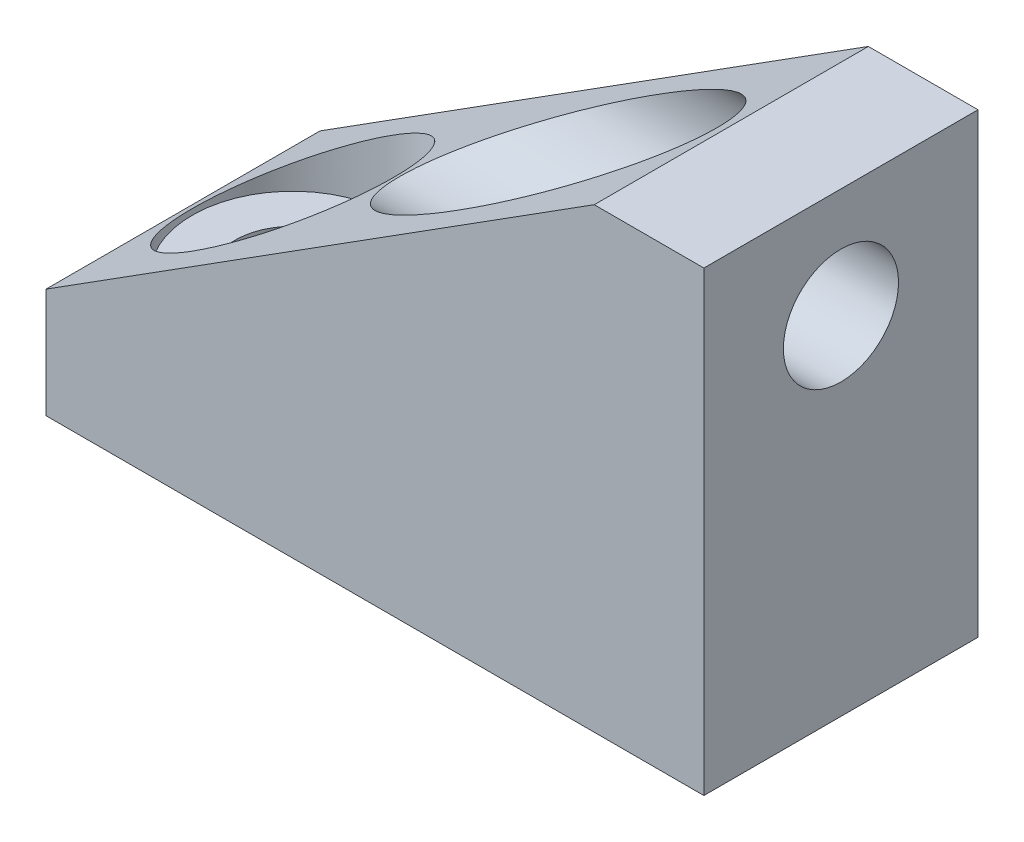
ISO-10303-21;
HEADER;
FILE_DESCRIPTION(('STEP AP214'),'2;1');
FILE_NAME('part.step','',(''),(''),'','','');
FILE_SCHEMA(('AUTOMOTIVE_DESIGN { 1 0 10303 214 1 1 1 1 }'));
ENDSEC;
DATA;
#1=APPLICATION_CONTEXT('core data for automotive mechanical design processes');
#2=APPLICATION_PROTOCOL_DEFINITION('international standard','automotive_design',2000,#1);
#3=PRODUCT_CONTEXT('',#1,'mechanical');
#4=PRODUCT('Part','Part','',(#3));
#5=PRODUCT_RELATED_PRODUCT_CATEGORY('part','',(#4));
#6=PRODUCT_DEFINITION_FORMATION('','',#4);
#7=PRODUCT_DEFINITION_CONTEXT('part definition',#1,'design');
#8=PRODUCT_DEFINITION('design','',#6,#7);
#9=PRODUCT_DEFINITION_SHAPE('','',#8);
#10=(LENGTH_UNIT() NAMED_UNIT(*) SI_UNIT(.MILLI.,.METRE.));
#11=(NAMED_UNIT(*) PLANE_ANGLE_UNIT() SI_UNIT($,.RADIAN.));
#12=(NAMED_UNIT(*) SI_UNIT($,.STERADIAN.) SOLID_ANGLE_UNIT());
#13=UNCERTAINTY_MEASURE_WITH_UNIT(LENGTH_MEASURE(1.E-05),#10,'distance_accuracy_value','');
#14=(GEOMETRIC_REPRESENTATION_CONTEXT(3) GLOBAL_UNCERTAINTY_ASSIGNED_CONTEXT((#13)) GLOBAL_UNIT_ASSIGNED_CONTEXT((#10,
#11,#12)) REPRESENTATION_CONTEXT('',''));
#15=CARTESIAN_POINT('',(0.,0.,0.));
#16=DIRECTION('',(0.,0.,1.));
#17=DIRECTION('',(1.,0.,0.));
#18=AXIS2_PLACEMENT_3D('',#15,#16,#17);
#19=CARTESIAN_POINT('',(-2.04027772216514,3.22149114026075,15.));
#20=DIRECTION('',(-0.535052081184345,0.844819075554228,0.));
#21=DIRECTION('',(-0.844819075554229,-0.535052081184345,0.));
#22=AXIS2_PLACEMENT_3D('',#19,#20,#21);
#23=PLANE('',#22);
#24=DIRECTION('',(0.844819075554229,0.535052081184345,0.));
#25=VECTOR('',#24,1.);
#26=CARTESIAN_POINT('',(-2.04027772216514,3.22149114026075,0.));
#27=LINE('',#26,#25);
#28=CARTESIAN_POINT('',(2.34684153005472,6.,0.));
#29=VERTEX_POINT('',#28);
#30=CARTESIAN_POINT('',(32.3468415300547,25.,0.));
#31=VERTEX_POINT('',#30);
#32=EDGE_CURVE('E126',#29,#31,#27,.T.);
#33=ORIENTED_EDGE('',*,*,#32,.F.);
#34=DIRECTION('',(0.,0.,-1.));
#35=VECTOR('',#34,1.);
#36=CARTESIAN_POINT('',(2.34684153005472,6.,15.));
#37=LINE('',#36,#35);
#38=CARTESIAN_POINT('',(2.34684153005472,6.,15.));
#39=VERTEX_POINT('',#38);
#40=EDGE_CURVE('E12',#39,#29,#37,.T.);
#41=ORIENTED_EDGE('',*,*,#40,.F.);
#42=DIRECTION('',(0.844819075554229,0.535052081184345,0.));
#43=VECTOR('',#42,1.);
#44=CARTESIAN_POINT('',(-2.04027772216514,3.22149114026075,15.));
#45=LINE('',#44,#43);
#46=CARTESIAN_POINT('',(32.3468415300547,25.,15.));
#47=VERTEX_POINT('',#46);
#48=EDGE_CURVE('E142',#39,#47,#45,.T.);
#49=ORIENTED_EDGE('',*,*,#48,.T.);
#50=DIRECTION('',(0.,0.,-1.));
#51=VECTOR('',#50,1.);
#52=CARTESIAN_POINT('',(32.3468415300547,25.,15.));
#53=LINE('',#52,#51);
#54=EDGE_CURVE('E92',#47,#31,#53,.T.);
#55=ORIENTED_EDGE('',*,*,#54,.T.);
#56=EDGE_LOOP('',(#33,#41,#49,#55));
#57=FACE_BOUND('',#56,.T.);
#58=CARTESIAN_POINT('',(8.34684153005472,9.8,7.5));
#59=DIRECTION('',(-0.535052081184345,0.844819075554228,0.));
#60=DIRECTION('',(0.844819075554229,0.535052081184345,0.));
#61=AXIS2_PLACEMENT_3D('',#58,#59,#60);
#62=ELLIPSE('',#61,6.51026966500706,5.5);
#63=CARTESIAN_POINT('',(13.8468415300547,13.2833333333333,7.5));
#64=VERTEX_POINT('',#63);
#65=EDGE_CURVE('E148',#64,#64,#62,.T.);
#66=ORIENTED_EDGE('',*,*,#65,.F.);
#67=EDGE_LOOP('',(#66));
#68=FACE_BOUND('',#67,.T.);
#69=CARTESIAN_POINT('',(22.8731573195284,19.,7.49999999999999));
#70=DIRECTION('',(-0.535052081184345,0.844819075554228,0.));
#71=DIRECTION('',(-0.844819075554229,-0.535052081184345,0.));
#72=AXIS2_PLACEMENT_3D('',#69,#70,#71);
#73=ELLIPSE('',#72,10.2793731552743,5.5);
#74=CARTESIAN_POINT('',(14.1889467932126,13.5,7.49999999999999));
#75=VERTEX_POINT('',#74);
#76=EDGE_CURVE('E50',#75,#75,#73,.F.);
#77=ORIENTED_EDGE('',*,*,#76,.T.);
#78=EDGE_LOOP('',(#77));
#79=FACE_BOUND('',#78,.T.);
#80=ADVANCED_FACE('F47',(#57,#68,#79),#23,.T.);
#81=CARTESIAN_POINT('',(38.3468415300547,19.,7.49999999999999));
#82=DIRECTION('',(-1.,0.,0.));
#83=DIRECTION('',(0.,0.,1.));
#84=AXIS2_PLACEMENT_3D('',#81,#82,#83);
#85=CYLINDRICAL_SURFACE('',#84,3.15);
#86=CARTESIAN_POINT('',(38.3468415300547,19.,7.49999999999999));
#87=DIRECTION('',(1.,0.,0.));
#88=DIRECTION('',(0.,0.,-1.));
#89=AXIS2_PLACEMENT_3D('',#86,#87,#88);
#90=CIRCLE('',#89,3.15);
#91=CARTESIAN_POINT('',(38.3468415300547,19.,4.34999999999999));
#92=VERTEX_POINT('',#91);
#93=EDGE_CURVE('E165',#92,#92,#90,.T.);
#94=ORIENTED_EDGE('',*,*,#93,.T.);
#95=EDGE_LOOP('',(#94));
#96=FACE_BOUND('',#95,.T.);
#97=CARTESIAN_POINT('',(32.3468415300547,19.,7.49999999999999));
#98=DIRECTION('',(-1.,0.,0.));
#99=DIRECTION('',(0.,0.,1.));
#100=AXIS2_PLACEMENT_3D('',#97,#98,#99);
#101=CIRCLE('',#100,3.15);
#102=CARTESIAN_POINT('',(32.3468415300547,19.,10.65));
#103=VERTEX_POINT('',#102);
#104=EDGE_CURVE('E187',#103,#103,#101,.T.);
#105=ORIENTED_EDGE('',*,*,#104,.T.);
#106=EDGE_LOOP('',(#105));
#107=FACE_BOUND('',#106,.T.);
#108=ADVANCED_FACE('F181',(#96,#107),#85,.F.);
#109=CARTESIAN_POINT('',(8.34684153005472,0.,7.5));
#110=DIRECTION('',(0.,1.,0.));
#111=DIRECTION('',(0.,0.,1.));
#112=AXIS2_PLACEMENT_3D('',#109,#110,#111);
#113=CYLINDRICAL_SURFACE('',#112,3.15);
#114=CARTESIAN_POINT('',(8.34684153005472,0.,7.5));
#115=DIRECTION('',(0.,1.,0.));
#116=DIRECTION('',(0.,0.,1.));
#117=AXIS2_PLACEMENT_3D('',#114,#115,#116);
#118=CIRCLE('',#117,3.15);
#119=CARTESIAN_POINT('',(8.34684153005472,0.,10.65));
#120=VERTEX_POINT('',#119);
#121=EDGE_CURVE('E131',#120,#120,#118,.T.);
#122=ORIENTED_EDGE('',*,*,#121,.F.);
#123=EDGE_LOOP('',(#122));
#124=FACE_BOUND('',#123,.T.);
#125=CARTESIAN_POINT('',(8.34684153005472,6.,7.5));
#126=DIRECTION('',(0.,1.,0.));
#127=DIRECTION('',(0.,0.,1.));
#128=AXIS2_PLACEMENT_3D('',#125,#126,#127);
#129=CIRCLE('',#128,3.15);
#130=CARTESIAN_POINT('',(8.34684153005472,6.,10.65));
#131=VERTEX_POINT('',#130);
#132=EDGE_CURVE('E159',#131,#131,#129,.T.);
#133=ORIENTED_EDGE('',*,*,#132,.T.);
#134=EDGE_LOOP('',(#133));
#135=FACE_BOUND('',#134,.T.);
#136=ADVANCED_FACE('F218',(#124,#135),#113,.F.);
#137=CARTESIAN_POINT('',(2.34684153005472,0.,15.));
#138=DIRECTION('',(-1.,0.,0.));
#139=DIRECTION('',(0.,0.,1.));
#140=AXIS2_PLACEMENT_3D('',#137,#138,#139);
#141=PLANE('',#140);
#142=DIRECTION('',(0.,1.,0.));
#143=VECTOR('',#142,1.);
#144=CARTESIAN_POINT('',(2.34684153005472,0.,0.));
#145=LINE('',#144,#143);
#146=CARTESIAN_POINT('',(2.34684153005472,0.,0.));
#147=VERTEX_POINT('',#146);
#148=EDGE_CURVE('E130',#147,#29,#145,.T.);
#149=ORIENTED_EDGE('',*,*,#148,.F.);
#150=DIRECTION('',(0.,0.,-1.));
#151=VECTOR('',#150,1.);
#152=CARTESIAN_POINT('',(2.34684153005472,0.,15.));
#153=LINE('',#152,#151);
#154=CARTESIAN_POINT('',(2.34684153005472,0.,15.));
#155=VERTEX_POINT('',#154);
#156=EDGE_CURVE('E57',#155,#147,#153,.T.);
#157=ORIENTED_EDGE('',*,*,#156,.F.);
#158=DIRECTION('',(0.,1.,0.));
#159=VECTOR('',#158,1.);
#160=CARTESIAN_POINT('',(2.34684153005472,0.,15.));
#161=LINE('',#160,#159);
#162=EDGE_CURVE('E108',#155,#39,#161,.T.);
#163=ORIENTED_EDGE('',*,*,#162,.T.);
#164=ORIENTED_EDGE('',*,*,#40,.T.);
#165=EDGE_LOOP('',(#149,#157,#163,#164));
#166=FACE_BOUND('',#165,.T.);
#167=ADVANCED_FACE('F173',(#166),#141,.T.);
#168=CARTESIAN_POINT('',(0.,0.,15.));
#169=DIRECTION('',(0.,1.,0.));
#170=DIRECTION('',(0.,0.,1.));
#171=AXIS2_PLACEMENT_3D('',#168,#169,#170);
#172=PLANE('',#171);
#173=ORIENTED_EDGE('',*,*,#121,.T.);
#174=EDGE_LOOP('',(#173));
#175=FACE_BOUND('',#174,.T.);
#176=DIRECTION('',(1.,0.,0.));
#177=VECTOR('',#176,1.);
#178=CARTESIAN_POINT('',(0.,0.,0.));
#179=LINE('',#178,#177);
#180=CARTESIAN_POINT('',(38.3468415300547,0.,0.));
#181=VERTEX_POINT('',#180);
#182=EDGE_CURVE('E115',#147,#181,#179,.T.);
#183=ORIENTED_EDGE('',*,*,#182,.T.);
#184=DIRECTION('',(0.,0.,-1.));
#185=VECTOR('',#184,1.);
#186=CARTESIAN_POINT('',(38.3468415300547,0.,15.));
#187=LINE('',#186,#185);
#188=CARTESIAN_POINT('',(38.3468415300547,0.,15.));
#189=VERTEX_POINT('',#188);
#190=EDGE_CURVE('E112',#189,#181,#187,.T.);
#191=ORIENTED_EDGE('',*,*,#190,.F.);
#192=DIRECTION('',(1.,0.,0.));
#193=VECTOR('',#192,1.);
#194=CARTESIAN_POINT('',(0.,0.,15.));
#195=LINE('',#194,#193);
#196=EDGE_CURVE('E102',#155,#189,#195,.T.);
#197=ORIENTED_EDGE('',*,*,#196,.F.);
#198=ORIENTED_EDGE('',*,*,#156,.T.);
#199=EDGE_LOOP('',(#183,#191,#197,#198));
#200=FACE_BOUND('',#199,.T.);
#201=ADVANCED_FACE('F113',(#175,#200),#172,.F.);
#202=CARTESIAN_POINT('',(38.3468415300547,0.,15.));
#203=DIRECTION('',(-1.,0.,0.));
#204=DIRECTION('',(0.,0.,1.));
#205=AXIS2_PLACEMENT_3D('',#202,#203,#204);
#206=PLANE('',#205);
#207=ORIENTED_EDGE('',*,*,#93,.F.);
#208=EDGE_LOOP('',(#207));
#209=FACE_BOUND('',#208,.T.);
#210=DIRECTION('',(0.,1.,0.));
#211=VECTOR('',#210,1.);
#212=CARTESIAN_POINT('',(38.3468415300547,0.,0.));
#213=LINE('',#212,#211);
#214=CARTESIAN_POINT('',(38.3468415300547,25.,0.));
#215=VERTEX_POINT('',#214);
#216=EDGE_CURVE('E85',#181,#215,#213,.T.);
#217=ORIENTED_EDGE('',*,*,#216,.T.);
#218=DIRECTION('',(0.,0.,-1.));
#219=VECTOR('',#218,1.);
#220=CARTESIAN_POINT('',(38.3468415300547,25.,15.));
#221=LINE('',#220,#219);
#222=CARTESIAN_POINT('',(38.3468415300547,25.,15.));
#223=VERTEX_POINT('',#222);
#224=EDGE_CURVE('E117',#223,#215,#221,.T.);
#225=ORIENTED_EDGE('',*,*,#224,.F.);
#226=DIRECTION('',(0.,1.,0.));
#227=VECTOR('',#226,1.);
#228=CARTESIAN_POINT('',(38.3468415300547,0.,15.));
#229=LINE('',#228,#227);
#230=EDGE_CURVE('E106',#189,#223,#229,.T.);
#231=ORIENTED_EDGE('',*,*,#230,.F.);
#232=ORIENTED_EDGE('',*,*,#190,.T.);
#233=EDGE_LOOP('',(#217,#225,#231,#232));
#234=FACE_BOUND('',#233,.T.);
#235=ADVANCED_FACE('F119',(#209,#234),#206,.F.);
#236=CARTESIAN_POINT('',(0.,25.,15.));
#237=DIRECTION('',(0.,-1.,0.));
#238=DIRECTION('',(0.,0.,-1.));
#239=AXIS2_PLACEMENT_3D('',#236,#237,#238);
#240=PLANE('',#239);
#241=DIRECTION('',(-1.,0.,0.));
#242=VECTOR('',#241,1.);
#243=CARTESIAN_POINT('',(0.,25.,0.));
#244=LINE('',#243,#242);
#245=EDGE_CURVE('E139',#215,#31,#244,.T.);
#246=ORIENTED_EDGE('',*,*,#245,.T.);
#247=ORIENTED_EDGE('',*,*,#54,.F.);
#248=DIRECTION('',(-1.,0.,0.));
#249=VECTOR('',#248,1.);
#250=CARTESIAN_POINT('',(0.,25.,15.));
#251=LINE('',#250,#249);
#252=EDGE_CURVE('E66',#223,#47,#251,.T.);
#253=ORIENTED_EDGE('',*,*,#252,.F.);
#254=ORIENTED_EDGE('',*,*,#224,.T.);
#255=EDGE_LOOP('',(#246,#247,#253,#254));
#256=FACE_BOUND('',#255,.T.);
#257=ADVANCED_FACE('F178',(#256),#240,.F.);
#258=CARTESIAN_POINT('',(0.,0.,15.));
#259=DIRECTION('',(0.,0.,1.));
#260=DIRECTION('',(1.,0.,0.));
#261=AXIS2_PLACEMENT_3D('',#258,#259,#260);
#262=PLANE('',#261);
#263=ORIENTED_EDGE('',*,*,#48,.F.);
#264=ORIENTED_EDGE('',*,*,#162,.F.);
#265=ORIENTED_EDGE('',*,*,#196,.T.);
#266=ORIENTED_EDGE('',*,*,#230,.T.);
#267=ORIENTED_EDGE('',*,*,#252,.T.);
#268=EDGE_LOOP('',(#263,#264,#265,#266,#267));
#269=FACE_BOUND('',#268,.T.);
#270=ADVANCED_FACE('F104',(#269),#262,.T.);
#271=CARTESIAN_POINT('',(0.,0.,0.));
#272=DIRECTION('',(0.,0.,1.));
#273=DIRECTION('',(1.,0.,0.));
#274=AXIS2_PLACEMENT_3D('',#271,#272,#273);
#275=PLANE('',#274);
#276=ORIENTED_EDGE('',*,*,#32,.T.);
#277=ORIENTED_EDGE('',*,*,#245,.F.);
#278=ORIENTED_EDGE('',*,*,#216,.F.);
#279=ORIENTED_EDGE('',*,*,#182,.F.);
#280=ORIENTED_EDGE('',*,*,#148,.T.);
#281=EDGE_LOOP('',(#276,#277,#278,#279,#280));
#282=FACE_BOUND('',#281,.T.);
#283=ADVANCED_FACE('F175',(#282),#275,.F.);
#284=CARTESIAN_POINT('',(8.34684153005472,6.,7.5));
#285=DIRECTION('',(0.,1.,0.));
#286=DIRECTION('',(0.,0.,1.));
#287=AXIS2_PLACEMENT_3D('',#284,#285,#286);
#288=CYLINDRICAL_SURFACE('',#287,5.5);
#289=ORIENTED_EDGE('',*,*,#65,.T.);
#290=EDGE_LOOP('',(#289));
#291=FACE_BOUND('',#290,.T.);
#292=CARTESIAN_POINT('',(8.34684153005472,6.,7.5));
#293=DIRECTION('',(0.,1.,0.));
#294=DIRECTION('',(0.,0.,1.));
#295=AXIS2_PLACEMENT_3D('',#292,#293,#294);
#296=CIRCLE('',#295,5.5);
#297=CARTESIAN_POINT('',(8.34684153005472,6.,13.));
#298=VERTEX_POINT('',#297);
#299=EDGE_CURVE('E151',#298,#298,#296,.T.);
#300=ORIENTED_EDGE('',*,*,#299,.F.);
#301=EDGE_LOOP('',(#300));
#302=FACE_BOUND('',#301,.T.);
#303=ADVANCED_FACE('F213',(#291,#302),#288,.F.);
#304=CARTESIAN_POINT('',(8.34684153005472,6.,7.5));
#305=DIRECTION('',(0.,1.,0.));
#306=DIRECTION('',(0.,0.,1.));
#307=AXIS2_PLACEMENT_3D('',#304,#305,#306);
#308=PLANE('',#307);
#309=ORIENTED_EDGE('',*,*,#132,.F.);
#310=EDGE_LOOP('',(#309));
#311=FACE_BOUND('',#310,.T.);
#312=ORIENTED_EDGE('',*,*,#299,.T.);
#313=EDGE_LOOP('',(#312));
#314=FACE_BOUND('',#313,.T.);
#315=ADVANCED_FACE('F205',(#311,#314),#308,.T.);
#316=CARTESIAN_POINT('',(53.9031907161588,19.,7.49999999999999));
#317=DIRECTION('',(-1.,0.,0.));
#318=DIRECTION('',(0.,0.,1.));
#319=AXIS2_PLACEMENT_3D('',#316,#317,#318);
#320=CYLINDRICAL_SURFACE('',#319,5.5);
#321=ORIENTED_EDGE('',*,*,#76,.F.);
#322=EDGE_LOOP('',(#321));
#323=FACE_BOUND('',#322,.T.);
#324=CARTESIAN_POINT('',(32.3468415300547,19.,7.49999999999999));
#325=DIRECTION('',(-1.,0.,0.));
#326=DIRECTION('',(0.,0.,1.));
#327=AXIS2_PLACEMENT_3D('',#324,#325,#326);
#328=CIRCLE('',#327,5.5);
#329=CARTESIAN_POINT('',(32.3468415300547,19.,13.));
#330=VERTEX_POINT('',#329);
#331=EDGE_CURVE('E192',#330,#330,#328,.T.);
#332=ORIENTED_EDGE('',*,*,#331,.F.);
#333=EDGE_LOOP('',(#332));
#334=FACE_BOUND('',#333,.T.);
#335=ADVANCED_FACE('F203',(#323,#334),#320,.F.);
#336=CARTESIAN_POINT('',(32.3468415300547,0.,15.));
#337=DIRECTION('',(-1.,0.,0.));
#338=DIRECTION('',(0.,0.,1.));
#339=AXIS2_PLACEMENT_3D('',#336,#337,#338);
#340=PLANE('',#339);
#341=ORIENTED_EDGE('',*,*,#104,.F.);
#342=EDGE_LOOP('',(#341));
#343=FACE_BOUND('',#342,.T.);
#344=ORIENTED_EDGE('',*,*,#331,.T.);
#345=EDGE_LOOP('',(#344));
#346=FACE_BOUND('',#345,.T.);
#347=ADVANCED_FACE('F201',(#343,#346),#340,.T.);
#348=CLOSED_SHELL('',(#80,#108,#136,#167,#201,#235,#257,#270,#283,#303,#315,#335,#347));
#349=MANIFOLD_SOLID_BREP('B2',#348);
#350=ADVANCED_BREP_SHAPE_REPRESENTATION('',(#18,#349),#14);
#351=SHAPE_DEFINITION_REPRESENTATION(#9,#350);
ENDSEC;
END-ISO-10303-21;
